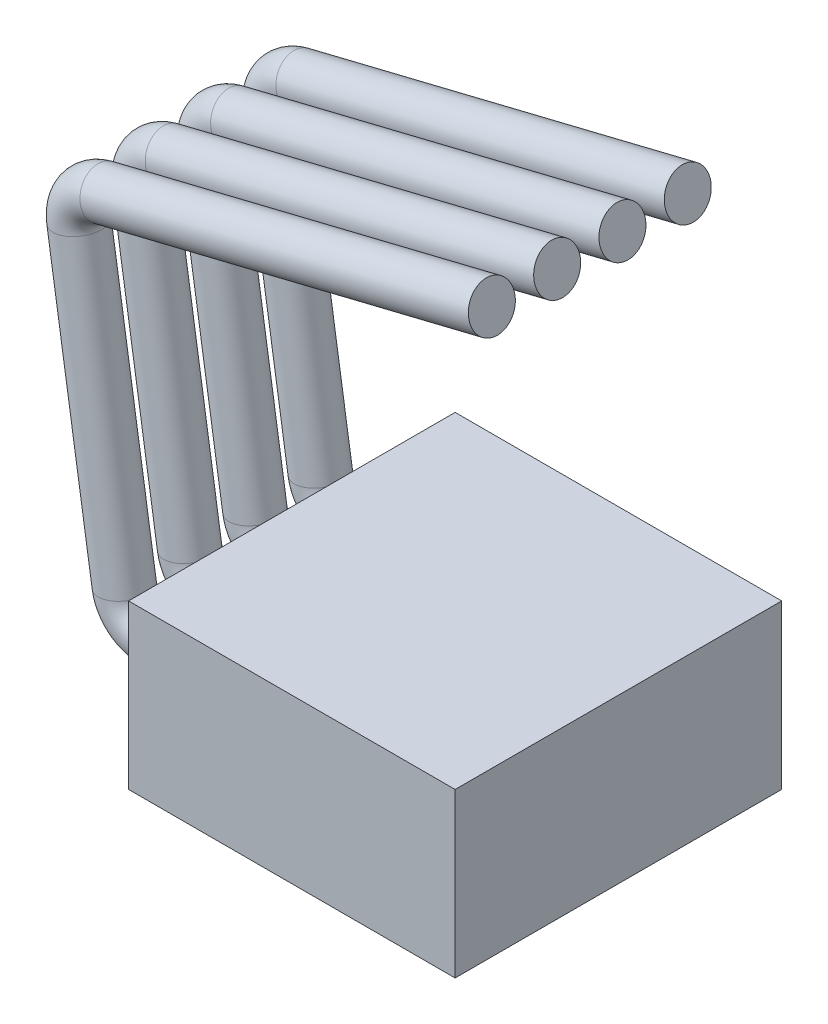
ISO-10303-21;
HEADER;
FILE_DESCRIPTION(('STEP AP214'),'2;1');
FILE_NAME('part.step','',(''),(''),'','','');
FILE_SCHEMA(('AUTOMOTIVE_DESIGN { 1 0 10303 214 1 1 1 1 }'));
ENDSEC;
DATA;
#1=APPLICATION_CONTEXT('core data for automotive mechanical design processes');
#2=APPLICATION_PROTOCOL_DEFINITION('international standard','automotive_design',2000,#1);
#3=PRODUCT_CONTEXT('',#1,'mechanical');
#4=PRODUCT('Part','Part','',(#3));
#5=PRODUCT_RELATED_PRODUCT_CATEGORY('part','',(#4));
#6=PRODUCT_DEFINITION_FORMATION('','',#4);
#7=PRODUCT_DEFINITION_CONTEXT('part definition',#1,'design');
#8=PRODUCT_DEFINITION('design','',#6,#7);
#9=PRODUCT_DEFINITION_SHAPE('','',#8);
#10=(LENGTH_UNIT() NAMED_UNIT(*) SI_UNIT(.MILLI.,.METRE.));
#11=(NAMED_UNIT(*) PLANE_ANGLE_UNIT() SI_UNIT($,.RADIAN.));
#12=(NAMED_UNIT(*) SI_UNIT($,.STERADIAN.) SOLID_ANGLE_UNIT());
#13=UNCERTAINTY_MEASURE_WITH_UNIT(LENGTH_MEASURE(1.E-05),#10,'distance_accuracy_value','');
#14=(GEOMETRIC_REPRESENTATION_CONTEXT(3) GLOBAL_UNCERTAINTY_ASSIGNED_CONTEXT((#13)) GLOBAL_UNIT_ASSIGNED_CONTEXT((#10,
#11,#12)) REPRESENTATION_CONTEXT('',''));
#15=CARTESIAN_POINT('',(0.,0.,0.));
#16=DIRECTION('',(0.,0.,1.));
#17=DIRECTION('',(1.,0.,0.));
#18=AXIS2_PLACEMENT_3D('',#15,#16,#17);
#19=CARTESIAN_POINT('',(-2.73181449711056,2.5,-1.21930927675658));
#20=DIRECTION('',(1.,0.,0.));
#21=DIRECTION('',(0.,0.,-1.));
#22=AXIS2_PLACEMENT_3D('',#19,#20,#21);
#23=PLANE('',#22);
#24=CARTESIAN_POINT('',(-2.73181449711056,1.25,2.78069072324342));
#25=DIRECTION('',(-1.,0.,0.));
#26=DIRECTION('',(0.,0.,1.));
#27=AXIS2_PLACEMENT_3D('',#24,#25,#26);
#28=CIRCLE('',#27,0.35);
#29=CARTESIAN_POINT('',(-2.73181449711056,1.25,3.13069072324342));
#30=VERTEX_POINT('',#29);
#31=EDGE_CURVE('E231',#30,#30,#28,.T.);
#32=ORIENTED_EDGE('',*,*,#31,.F.);
#33=EDGE_LOOP('',(#32));
#34=FACE_BOUND('',#33,.T.);
#35=CARTESIAN_POINT('',(-2.73181449711056,1.25,1.78069072324342));
#36=DIRECTION('',(-1.,0.,0.));
#37=DIRECTION('',(0.,0.,1.));
#38=AXIS2_PLACEMENT_3D('',#35,#36,#37);
#39=CIRCLE('',#38,0.35);
#40=CARTESIAN_POINT('',(-2.73181449711056,1.25,2.13069072324342));
#41=VERTEX_POINT('',#40);
#42=EDGE_CURVE('E207',#41,#41,#39,.T.);
#43=ORIENTED_EDGE('',*,*,#42,.F.);
#44=EDGE_LOOP('',(#43));
#45=FACE_BOUND('',#44,.T.);
#46=CARTESIAN_POINT('',(-2.73181449711056,1.25,0.780690723243416));
#47=DIRECTION('',(-1.,0.,0.));
#48=DIRECTION('',(0.,0.,1.));
#49=AXIS2_PLACEMENT_3D('',#46,#47,#48);
#50=CIRCLE('',#49,0.35);
#51=CARTESIAN_POINT('',(-2.73181449711056,1.25,1.13069072324342));
#52=VERTEX_POINT('',#51);
#53=EDGE_CURVE('E183',#52,#52,#50,.T.);
#54=ORIENTED_EDGE('',*,*,#53,.F.);
#55=EDGE_LOOP('',(#54));
#56=FACE_BOUND('',#55,.T.);
#57=CARTESIAN_POINT('',(-2.73181449711056,1.25,-0.219309276756584));
#58=DIRECTION('',(-1.,0.,0.));
#59=DIRECTION('',(0.,0.,1.));
#60=AXIS2_PLACEMENT_3D('',#57,#58,#59);
#61=CIRCLE('',#60,0.35);
#62=CARTESIAN_POINT('',(-2.73181449711056,1.25,0.130690723243416));
#63=VERTEX_POINT('',#62);
#64=EDGE_CURVE('E12',#63,#63,#61,.T.);
#65=ORIENTED_EDGE('',*,*,#64,.F.);
#66=EDGE_LOOP('',(#65));
#67=FACE_BOUND('',#66,.T.);
#68=DIRECTION('',(0.,0.,1.));
#69=VECTOR('',#68,1.);
#70=CARTESIAN_POINT('',(-2.73181449711056,0.,-1.21930927675658));
#71=LINE('',#70,#69);
#72=CARTESIAN_POINT('',(-2.73181449711056,0.,-1.21930927675658));
#73=VERTEX_POINT('',#72);
#74=CARTESIAN_POINT('',(-2.73181449711056,0.,3.78069072324342));
#75=VERTEX_POINT('',#74);
#76=EDGE_CURVE('E123',#73,#75,#71,.T.);
#77=ORIENTED_EDGE('',*,*,#76,.T.);
#78=DIRECTION('',(0.,-1.,0.));
#79=VECTOR('',#78,1.);
#80=CARTESIAN_POINT('',(-2.73181449711056,2.5,3.78069072324342));
#81=LINE('',#80,#79);
#82=CARTESIAN_POINT('',(-2.73181449711056,2.5,3.78069072324342));
#83=VERTEX_POINT('',#82);
#84=EDGE_CURVE('E55',#83,#75,#81,.T.);
#85=ORIENTED_EDGE('',*,*,#84,.F.);
#86=DIRECTION('',(0.,0.,1.));
#87=VECTOR('',#86,1.);
#88=CARTESIAN_POINT('',(-2.73181449711056,2.5,-1.21930927675658));
#89=LINE('',#88,#87);
#90=CARTESIAN_POINT('',(-2.73181449711056,2.5,-1.21930927675658));
#91=VERTEX_POINT('',#90);
#92=EDGE_CURVE('E106',#91,#83,#89,.T.);
#93=ORIENTED_EDGE('',*,*,#92,.F.);
#94=DIRECTION('',(0.,-1.,0.));
#95=VECTOR('',#94,1.);
#96=CARTESIAN_POINT('',(-2.73181449711056,2.5,-1.21930927675658));
#97=LINE('',#96,#95);
#98=EDGE_CURVE('E119',#91,#73,#97,.T.);
#99=ORIENTED_EDGE('',*,*,#98,.T.);
#100=EDGE_LOOP('',(#77,#85,#93,#99));
#101=FACE_BOUND('',#100,.T.);
#102=ADVANCED_FACE('F52',(#34,#45,#56,#67,#101),#23,.F.);
#103=CARTESIAN_POINT('',(-2.73181449711056,2.5,3.78069072324342));
#104=DIRECTION('',(0.,0.,-1.));
#105=DIRECTION('',(-1.,0.,0.));
#106=AXIS2_PLACEMENT_3D('',#103,#104,#105);
#107=PLANE('',#106);
#108=DIRECTION('',(1.,0.,0.));
#109=VECTOR('',#108,1.);
#110=CARTESIAN_POINT('',(-2.73181449711056,0.,3.78069072324342));
#111=LINE('',#110,#109);
#112=CARTESIAN_POINT('',(2.26818550288944,0.,3.78069072324342));
#113=VERTEX_POINT('',#112);
#114=EDGE_CURVE('E112',#75,#113,#111,.T.);
#115=ORIENTED_EDGE('',*,*,#114,.T.);
#116=DIRECTION('',(0.,-1.,0.));
#117=VECTOR('',#116,1.);
#118=CARTESIAN_POINT('',(2.26818550288944,2.5,3.78069072324342));
#119=LINE('',#118,#117);
#120=CARTESIAN_POINT('',(2.26818550288944,2.5,3.78069072324342));
#121=VERTEX_POINT('',#120);
#122=EDGE_CURVE('E110',#121,#113,#119,.T.);
#123=ORIENTED_EDGE('',*,*,#122,.F.);
#124=DIRECTION('',(1.,0.,0.));
#125=VECTOR('',#124,1.);
#126=CARTESIAN_POINT('',(-2.73181449711056,2.5,3.78069072324342));
#127=LINE('',#126,#125);
#128=EDGE_CURVE('E101',#83,#121,#127,.T.);
#129=ORIENTED_EDGE('',*,*,#128,.F.);
#130=ORIENTED_EDGE('',*,*,#84,.T.);
#131=EDGE_LOOP('',(#115,#123,#129,#130));
#132=FACE_BOUND('',#131,.T.);
#133=ADVANCED_FACE('F111',(#132),#107,.F.);
#134=CARTESIAN_POINT('',(2.26818550288944,2.5,-1.21930927675658));
#135=DIRECTION('',(-1.,0.,0.));
#136=DIRECTION('',(0.,0.,1.));
#137=AXIS2_PLACEMENT_3D('',#134,#135,#136);
#138=PLANE('',#137);
#139=DIRECTION('',(0.,0.,-1.));
#140=VECTOR('',#139,1.);
#141=CARTESIAN_POINT('',(2.26818550288944,0.,-1.21930927675658));
#142=LINE('',#141,#140);
#143=CARTESIAN_POINT('',(2.26818550288944,0.,-1.21930927675658));
#144=VERTEX_POINT('',#143);
#145=EDGE_CURVE('E87',#113,#144,#142,.T.);
#146=ORIENTED_EDGE('',*,*,#145,.T.);
#147=DIRECTION('',(0.,-1.,0.));
#148=VECTOR('',#147,1.);
#149=CARTESIAN_POINT('',(2.26818550288944,2.5,-1.21930927675658));
#150=LINE('',#149,#148);
#151=CARTESIAN_POINT('',(2.26818550288944,2.5,-1.21930927675658));
#152=VERTEX_POINT('',#151);
#153=EDGE_CURVE('E114',#152,#144,#150,.T.);
#154=ORIENTED_EDGE('',*,*,#153,.F.);
#155=DIRECTION('',(0.,0.,-1.));
#156=VECTOR('',#155,1.);
#157=CARTESIAN_POINT('',(2.26818550288944,2.5,-1.21930927675658));
#158=LINE('',#157,#156);
#159=EDGE_CURVE('E104',#121,#152,#158,.T.);
#160=ORIENTED_EDGE('',*,*,#159,.F.);
#161=ORIENTED_EDGE('',*,*,#122,.T.);
#162=EDGE_LOOP('',(#146,#154,#160,#161));
#163=FACE_BOUND('',#162,.T.);
#164=ADVANCED_FACE('F115',(#163),#138,.F.);
#165=CARTESIAN_POINT('',(-2.73181449711056,2.5,-1.21930927675658));
#166=DIRECTION('',(0.,0.,1.));
#167=DIRECTION('',(1.,0.,0.));
#168=AXIS2_PLACEMENT_3D('',#165,#166,#167);
#169=PLANE('',#168);
#170=DIRECTION('',(-1.,0.,0.));
#171=VECTOR('',#170,1.);
#172=CARTESIAN_POINT('',(-2.73181449711056,0.,-1.21930927675658));
#173=LINE('',#172,#171);
#174=EDGE_CURVE('E93',#144,#73,#173,.T.);
#175=ORIENTED_EDGE('',*,*,#174,.T.);
#176=ORIENTED_EDGE('',*,*,#98,.F.);
#177=DIRECTION('',(-1.,0.,0.));
#178=VECTOR('',#177,1.);
#179=CARTESIAN_POINT('',(-2.73181449711056,2.5,-1.21930927675658));
#180=LINE('',#179,#178);
#181=EDGE_CURVE('E70',#152,#91,#180,.T.);
#182=ORIENTED_EDGE('',*,*,#181,.F.);
#183=ORIENTED_EDGE('',*,*,#153,.T.);
#184=EDGE_LOOP('',(#175,#176,#182,#183));
#185=FACE_BOUND('',#184,.T.);
#186=ADVANCED_FACE('F137',(#185),#169,.F.);
#187=CARTESIAN_POINT('',(0.,2.5,0.));
#188=DIRECTION('',(0.,1.,0.));
#189=DIRECTION('',(0.,0.,1.));
#190=AXIS2_PLACEMENT_3D('',#187,#188,#189);
#191=PLANE('',#190);
#192=ORIENTED_EDGE('',*,*,#92,.T.);
#193=ORIENTED_EDGE('',*,*,#128,.T.);
#194=ORIENTED_EDGE('',*,*,#159,.T.);
#195=ORIENTED_EDGE('',*,*,#181,.T.);
#196=EDGE_LOOP('',(#192,#193,#194,#195));
#197=FACE_BOUND('',#196,.T.);
#198=ADVANCED_FACE('F102',(#197),#191,.T.);
#199=CARTESIAN_POINT('',(0.,0.,0.));
#200=DIRECTION('',(0.,1.,0.));
#201=DIRECTION('',(0.,0.,1.));
#202=AXIS2_PLACEMENT_3D('',#199,#200,#201);
#203=PLANE('',#202);
#204=ORIENTED_EDGE('',*,*,#76,.F.);
#205=ORIENTED_EDGE('',*,*,#174,.F.);
#206=ORIENTED_EDGE('',*,*,#145,.F.);
#207=ORIENTED_EDGE('',*,*,#114,.F.);
#208=EDGE_LOOP('',(#204,#205,#206,#207));
#209=FACE_BOUND('',#208,.T.);
#210=ADVANCED_FACE('F140',(#209),#203,.F.);
#211=CARTESIAN_POINT('',(1.83023023670367,8.1836162278972,-0.219309276756584));
#212=DIRECTION('',(0.971175897060315,0.238363959039728,0.));
#213=DIRECTION('',(0.,0.,1.));
#214=AXIS2_PLACEMENT_3D('',#211,#212,#213);
#215=PLANE('',#214);
#216=CARTESIAN_POINT('',(1.83023023670367,8.1836162278972,-0.219309276756584));
#217=DIRECTION('',(0.971175897060315,0.238363959039728,0.));
#218=DIRECTION('',(0.,0.,1.));
#219=AXIS2_PLACEMENT_3D('',#216,#217,#218);
#220=CIRCLE('',#219,0.35);
#221=CARTESIAN_POINT('',(1.83023023670367,8.1836162278972,0.130690723243416));
#222=VERTEX_POINT('',#221);
#223=EDGE_CURVE('E127',#222,#222,#220,.T.);
#224=ORIENTED_EDGE('',*,*,#223,.T.);
#225=EDGE_LOOP('',(#224));
#226=FACE_BOUND('',#225,.T.);
#227=ADVANCED_FACE('F249',(#226),#215,.T.);
#228=CARTESIAN_POINT('',(-2.73181449711056,1.25,-0.219309276756584));
#229=DIRECTION('',(-1.,0.,0.));
#230=DIRECTION('',(0.,-1.,0.));
#231=AXIS2_PLACEMENT_3D('',#228,#229,#230);
#232=CYLINDRICAL_SURFACE('',#231,0.35);
#233=CARTESIAN_POINT('',(-3.30318697354395,1.25,-0.219309276756584));
#234=DIRECTION('',(-1.,0.,0.));
#235=DIRECTION('',(0.,0.,1.));
#236=AXIS2_PLACEMENT_3D('',#233,#234,#235);
#237=CIRCLE('',#236,0.35);
#238=CARTESIAN_POINT('',(-3.30318697354394,0.900000000000017,-0.219309276756584));
#239=VERTEX_POINT('',#238);
#240=EDGE_CURVE('E159',#239,#239,#237,.T.);
#241=ORIENTED_EDGE('',*,*,#240,.F.);
#242=EDGE_LOOP('',(#241));
#243=FACE_BOUND('',#242,.T.);
#244=ORIENTED_EDGE('',*,*,#64,.T.);
#245=EDGE_LOOP('',(#244));
#246=FACE_BOUND('',#245,.T.);
#247=ADVANCED_FACE('F246',(#243,#246),#232,.T.);
#248=CARTESIAN_POINT('',(-3.30318697354395,1.75,-0.219309276756584));
#249=DIRECTION('',(0.,0.,-1.));
#250=DIRECTION('',(-1.,0.,0.));
#251=AXIS2_PLACEMENT_3D('',#248,#249,#250);
#252=TOROIDAL_SURFACE('',#251,0.499999999999983,0.35);
#253=CARTESIAN_POINT('',(-3.79731450727413,1.67359332221769,-0.219309276756584));
#254=DIRECTION('',(-0.152813355564618,0.988255067460361,0.));
#255=DIRECTION('',(0.,0.,1.));
#256=AXIS2_PLACEMENT_3D('',#253,#254,#255);
#257=CIRCLE('',#256,0.35);
#258=CARTESIAN_POINT('',(-4.14320378088524,1.62010864777008,-0.219309276756584));
#259=VERTEX_POINT('',#258);
#260=EDGE_CURVE('E155',#259,#259,#257,.T.);
#261=CARTESIAN_POINT('',(-3.30318697354395,1.75,-0.219309276756584));
#262=DIRECTION('',(0.,0.,-1.));
#263=DIRECTION('',(-1.,0.,0.));
#264=AXIS2_PLACEMENT_3D('',#261,#262,#263);
#265=CIRCLE('',#264,0.849999999999983);
#266=EDGE_CURVE('',#239,#259,#265,.T.);
#267=ORIENTED_EDGE('',*,*,#240,.T.);
#268=ORIENTED_EDGE('',*,*,#260,.F.);
#269=ORIENTED_EDGE('',*,*,#266,.T.);
#270=ORIENTED_EDGE('',*,*,#266,.F.);
#271=EDGE_LOOP('',(#267,#269,#268,#270));
#272=FACE_BOUND('',#271,.T.);
#273=ADVANCED_FACE('F248',(#272),#252,.T.);
#274=CARTESIAN_POINT('',(-3.79731450727413,1.67359332221769,-0.219309276756584));
#275=DIRECTION('',(-0.152813355564624,0.98825506746036,0.));
#276=DIRECTION('',(-0.98825506746036,-0.152813355564624,0.));
#277=AXIS2_PLACEMENT_3D('',#274,#275,#276);
#278=CYLINDRICAL_SURFACE('',#277,0.35);
#279=CARTESIAN_POINT('',(-4.49136746434222,6.16208419642218,-0.219309276756584));
#280=DIRECTION('',(-0.152813355564624,0.98825506746036,0.));
#281=DIRECTION('',(0.,0.,1.));
#282=AXIS2_PLACEMENT_3D('',#279,#280,#281);
#283=CIRCLE('',#282,0.35);
#284=CARTESIAN_POINT('',(-4.83725673795334,6.10859952197456,-0.219309276756584));
#285=VERTEX_POINT('',#284);
#286=EDGE_CURVE('E151',#285,#285,#283,.T.);
#287=ORIENTED_EDGE('',*,*,#286,.F.);
#288=EDGE_LOOP('',(#287));
#289=FACE_BOUND('',#288,.T.);
#290=ORIENTED_EDGE('',*,*,#260,.T.);
#291=EDGE_LOOP('',(#290));
#292=FACE_BOUND('',#291,.T.);
#293=ADVANCED_FACE('F256',(#289,#292),#278,.T.);
#294=CARTESIAN_POINT('',(-3.99723993061203,6.23849087420449,-0.219309276756584));
#295=DIRECTION('',(0.,0.,-1.));
#296=DIRECTION('',(-1.,0.,0.));
#297=AXIS2_PLACEMENT_3D('',#294,#295,#296);
#298=TOROIDAL_SURFACE('',#297,0.500000000000001,0.35);
#299=CARTESIAN_POINT('',(-4.1164219101319,6.72407882273465,-0.219309276756584));
#300=DIRECTION('',(0.971175897060314,0.238363959039729,0.));
#301=DIRECTION('',(0.,0.,1.));
#302=AXIS2_PLACEMENT_3D('',#299,#300,#301);
#303=CIRCLE('',#302,0.35);
#304=CARTESIAN_POINT('',(-4.1998492957958,7.06399038670576,-0.219309276756584));
#305=VERTEX_POINT('',#304);
#306=EDGE_CURVE('E147',#305,#305,#303,.T.);
#307=CARTESIAN_POINT('',(-3.99723993061203,6.23849087420449,-0.219309276756584));
#308=DIRECTION('',(0.,0.,-1.));
#309=DIRECTION('',(-1.,0.,0.));
#310=AXIS2_PLACEMENT_3D('',#307,#308,#309);
#311=CIRCLE('',#310,0.850000000000001);
#312=EDGE_CURVE('',#285,#305,#311,.T.);
#313=ORIENTED_EDGE('',*,*,#286,.T.);
#314=ORIENTED_EDGE('',*,*,#306,.F.);
#315=ORIENTED_EDGE('',*,*,#312,.T.);
#316=ORIENTED_EDGE('',*,*,#312,.F.);
#317=EDGE_LOOP('',(#313,#315,#314,#316));
#318=FACE_BOUND('',#317,.T.);
#319=ADVANCED_FACE('F269',(#318),#298,.T.);
#320=CARTESIAN_POINT('',(-4.1164219101319,6.72407882273465,-0.219309276756584));
#321=DIRECTION('',(0.971175897060314,0.238363959039729,0.));
#322=DIRECTION('',(-0.238363959039729,0.971175897060314,0.));
#323=AXIS2_PLACEMENT_3D('',#320,#321,#322);
#324=CYLINDRICAL_SURFACE('',#323,0.35);
#325=ORIENTED_EDGE('',*,*,#223,.F.);
#326=EDGE_LOOP('',(#325));
#327=FACE_BOUND('',#326,.T.);
#328=ORIENTED_EDGE('',*,*,#306,.T.);
#329=EDGE_LOOP('',(#328));
#330=FACE_BOUND('',#329,.T.);
#331=ADVANCED_FACE('F273',(#327,#330),#324,.T.);
#332=CARTESIAN_POINT('',(1.83023023670367,8.1836162278972,0.780690723243416));
#333=DIRECTION('',(0.971175897060315,0.238363959039728,0.));
#334=DIRECTION('',(0.,0.,1.));
#335=AXIS2_PLACEMENT_3D('',#332,#333,#334);
#336=PLANE('',#335);
#337=CARTESIAN_POINT('',(1.83023023670367,8.1836162278972,0.780690723243416));
#338=DIRECTION('',(0.971175897060315,0.238363959039728,0.));
#339=DIRECTION('',(0.,0.,1.));
#340=AXIS2_PLACEMENT_3D('',#337,#338,#339);
#341=CIRCLE('',#340,0.35);
#342=CARTESIAN_POINT('',(1.83023023670367,8.1836162278972,1.13069072324342));
#343=VERTEX_POINT('',#342);
#344=EDGE_CURVE('E162',#343,#343,#341,.T.);
#345=ORIENTED_EDGE('',*,*,#344,.T.);
#346=EDGE_LOOP('',(#345));
#347=FACE_BOUND('',#346,.T.);
#348=ADVANCED_FACE('F264',(#347),#336,.T.);
#349=CARTESIAN_POINT('',(-2.73181449711056,1.25,0.780690723243416));
#350=DIRECTION('',(-1.,0.,0.));
#351=DIRECTION('',(0.,-1.,0.));
#352=AXIS2_PLACEMENT_3D('',#349,#350,#351);
#353=CYLINDRICAL_SURFACE('',#352,0.35);
#354=CARTESIAN_POINT('',(-3.30318697354395,1.25,0.780690723243416));
#355=DIRECTION('',(-1.,0.,0.));
#356=DIRECTION('',(0.,0.,1.));
#357=AXIS2_PLACEMENT_3D('',#354,#355,#356);
#358=CIRCLE('',#357,0.35);
#359=CARTESIAN_POINT('',(-3.30318697354394,0.900000000000018,0.780690723243416));
#360=VERTEX_POINT('',#359);
#361=EDGE_CURVE('E179',#360,#360,#358,.T.);
#362=ORIENTED_EDGE('',*,*,#361,.F.);
#363=EDGE_LOOP('',(#362));
#364=FACE_BOUND('',#363,.T.);
#365=ORIENTED_EDGE('',*,*,#53,.T.);
#366=EDGE_LOOP('',(#365));
#367=FACE_BOUND('',#366,.T.);
#368=ADVANCED_FACE('F356',(#364,#367),#353,.T.);
#369=CARTESIAN_POINT('',(-3.30318697354395,1.75,0.780690723243416));
#370=DIRECTION('',(0.,0.,-1.));
#371=DIRECTION('',(-1.,0.,0.));
#372=AXIS2_PLACEMENT_3D('',#369,#370,#371);
#373=TOROIDAL_SURFACE('',#372,0.499999999999983,0.35);
#374=CARTESIAN_POINT('',(-3.79731450727413,1.67359332221769,0.780690723243416));
#375=DIRECTION('',(-0.152813355564618,0.988255067460361,0.));
#376=DIRECTION('',(0.,0.,1.));
#377=AXIS2_PLACEMENT_3D('',#374,#375,#376);
#378=CIRCLE('',#377,0.35);
#379=CARTESIAN_POINT('',(-4.14320378088524,1.62010864777008,0.780690723243416));
#380=VERTEX_POINT('',#379);
#381=EDGE_CURVE('E175',#380,#380,#378,.T.);
#382=CARTESIAN_POINT('',(-3.30318697354395,1.75,0.780690723243416));
#383=DIRECTION('',(0.,0.,-1.));
#384=DIRECTION('',(-1.,0.,0.));
#385=AXIS2_PLACEMENT_3D('',#382,#383,#384);
#386=CIRCLE('',#385,0.849999999999983);
#387=EDGE_CURVE('',#360,#380,#386,.T.);
#388=ORIENTED_EDGE('',*,*,#361,.T.);
#389=ORIENTED_EDGE('',*,*,#381,.F.);
#390=ORIENTED_EDGE('',*,*,#387,.T.);
#391=ORIENTED_EDGE('',*,*,#387,.F.);
#392=EDGE_LOOP('',(#388,#390,#389,#391));
#393=FACE_BOUND('',#392,.T.);
#394=ADVANCED_FACE('F366',(#393),#373,.T.);
#395=CARTESIAN_POINT('',(-3.79731450727413,1.67359332221769,0.780690723243416));
#396=DIRECTION('',(-0.152813355564624,0.98825506746036,0.));
#397=DIRECTION('',(-0.98825506746036,-0.152813355564624,0.));
#398=AXIS2_PLACEMENT_3D('',#395,#396,#397);
#399=CYLINDRICAL_SURFACE('',#398,0.35);
#400=CARTESIAN_POINT('',(-4.49136746434222,6.16208419642218,0.780690723243416));
#401=DIRECTION('',(-0.152813355564624,0.98825506746036,0.));
#402=DIRECTION('',(0.,0.,1.));
#403=AXIS2_PLACEMENT_3D('',#400,#401,#402);
#404=CIRCLE('',#403,0.35);
#405=CARTESIAN_POINT('',(-4.83725673795334,6.10859952197456,0.780690723243416));
#406=VERTEX_POINT('',#405);
#407=EDGE_CURVE('E171',#406,#406,#404,.T.);
#408=ORIENTED_EDGE('',*,*,#407,.F.);
#409=EDGE_LOOP('',(#408));
#410=FACE_BOUND('',#409,.T.);
#411=ORIENTED_EDGE('',*,*,#381,.T.);
#412=EDGE_LOOP('',(#411));
#413=FACE_BOUND('',#412,.T.);
#414=ADVANCED_FACE('F376',(#410,#413),#399,.T.);
#415=CARTESIAN_POINT('',(-3.99723993061203,6.23849087420449,0.780690723243416));
#416=DIRECTION('',(0.,0.,-1.));
#417=DIRECTION('',(-1.,0.,0.));
#418=AXIS2_PLACEMENT_3D('',#415,#416,#417);
#419=TOROIDAL_SURFACE('',#418,0.500000000000001,0.35);
#420=CARTESIAN_POINT('',(-4.1164219101319,6.72407882273465,0.780690723243416));
#421=DIRECTION('',(0.971175897060314,0.238363959039729,0.));
#422=DIRECTION('',(0.,0.,1.));
#423=AXIS2_PLACEMENT_3D('',#420,#421,#422);
#424=CIRCLE('',#423,0.35);
#425=CARTESIAN_POINT('',(-4.1998492957958,7.06399038670576,0.780690723243416));
#426=VERTEX_POINT('',#425);
#427=EDGE_CURVE('E167',#426,#426,#424,.T.);
#428=CARTESIAN_POINT('',(-3.99723993061203,6.23849087420449,0.780690723243416));
#429=DIRECTION('',(0.,0.,-1.));
#430=DIRECTION('',(-1.,0.,0.));
#431=AXIS2_PLACEMENT_3D('',#428,#429,#430);
#432=CIRCLE('',#431,0.850000000000001);
#433=EDGE_CURVE('',#406,#426,#432,.T.);
#434=ORIENTED_EDGE('',*,*,#407,.T.);
#435=ORIENTED_EDGE('',*,*,#427,.F.);
#436=ORIENTED_EDGE('',*,*,#433,.T.);
#437=ORIENTED_EDGE('',*,*,#433,.F.);
#438=EDGE_LOOP('',(#434,#436,#435,#437));
#439=FACE_BOUND('',#438,.T.);
#440=ADVANCED_FACE('F386',(#439),#419,.T.);
#441=CARTESIAN_POINT('',(-4.1164219101319,6.72407882273465,0.780690723243416));
#442=DIRECTION('',(0.971175897060314,0.238363959039729,0.));
#443=DIRECTION('',(-0.238363959039729,0.971175897060314,0.));
#444=AXIS2_PLACEMENT_3D('',#441,#442,#443);
#445=CYLINDRICAL_SURFACE('',#444,0.35);
#446=ORIENTED_EDGE('',*,*,#344,.F.);
#447=EDGE_LOOP('',(#446));
#448=FACE_BOUND('',#447,.T.);
#449=ORIENTED_EDGE('',*,*,#427,.T.);
#450=EDGE_LOOP('',(#449));
#451=FACE_BOUND('',#450,.T.);
#452=ADVANCED_FACE('F261',(#448,#451),#445,.T.);
#453=CARTESIAN_POINT('',(1.83023023670367,8.1836162278972,1.78069072324342));
#454=DIRECTION('',(0.971175897060315,0.238363959039728,0.));
#455=DIRECTION('',(0.,0.,1.));
#456=AXIS2_PLACEMENT_3D('',#453,#454,#455);
#457=PLANE('',#456);
#458=CARTESIAN_POINT('',(1.83023023670367,8.1836162278972,1.78069072324342));
#459=DIRECTION('',(0.971175897060315,0.238363959039728,0.));
#460=DIRECTION('',(0.,0.,1.));
#461=AXIS2_PLACEMENT_3D('',#458,#459,#460);
#462=CIRCLE('',#461,0.35);
#463=CARTESIAN_POINT('',(1.83023023670367,8.1836162278972,2.13069072324342));
#464=VERTEX_POINT('',#463);
#465=EDGE_CURVE('E187',#464,#464,#462,.T.);
#466=ORIENTED_EDGE('',*,*,#465,.T.);
#467=EDGE_LOOP('',(#466));
#468=FACE_BOUND('',#467,.T.);
#469=ADVANCED_FACE('F405',(#468),#457,.T.);
#470=CARTESIAN_POINT('',(-2.73181449711056,1.25,1.78069072324342));
#471=DIRECTION('',(-1.,0.,0.));
#472=DIRECTION('',(0.,-1.,0.));
#473=AXIS2_PLACEMENT_3D('',#470,#471,#472);
#474=CYLINDRICAL_SURFACE('',#473,0.35);
#475=CARTESIAN_POINT('',(-3.30318697354395,1.25,1.78069072324342));
#476=DIRECTION('',(-1.,0.,0.));
#477=DIRECTION('',(0.,0.,1.));
#478=AXIS2_PLACEMENT_3D('',#475,#476,#477);
#479=CIRCLE('',#478,0.35);
#480=CARTESIAN_POINT('',(-3.30318697354394,0.900000000000018,1.78069072324342));
#481=VERTEX_POINT('',#480);
#482=EDGE_CURVE('E203',#481,#481,#479,.T.);
#483=ORIENTED_EDGE('',*,*,#482,.F.);
#484=EDGE_LOOP('',(#483));
#485=FACE_BOUND('',#484,.T.);
#486=ORIENTED_EDGE('',*,*,#42,.T.);
#487=EDGE_LOOP('',(#486));
#488=FACE_BOUND('',#487,.T.);
#489=ADVANCED_FACE('F414',(#485,#488),#474,.T.);
#490=CARTESIAN_POINT('',(-3.30318697354395,1.75,1.78069072324342));
#491=DIRECTION('',(0.,0.,-1.));
#492=DIRECTION('',(-1.,0.,0.));
#493=AXIS2_PLACEMENT_3D('',#490,#491,#492);
#494=TOROIDAL_SURFACE('',#493,0.499999999999983,0.35);
#495=CARTESIAN_POINT('',(-3.79731450727413,1.67359332221769,1.78069072324342));
#496=DIRECTION('',(-0.152813355564618,0.988255067460361,0.));
#497=DIRECTION('',(0.,0.,1.));
#498=AXIS2_PLACEMENT_3D('',#495,#496,#497);
#499=CIRCLE('',#498,0.35);
#500=CARTESIAN_POINT('',(-4.14320378088524,1.62010864777008,1.78069072324342));
#501=VERTEX_POINT('',#500);
#502=EDGE_CURVE('E199',#501,#501,#499,.T.);
#503=CARTESIAN_POINT('',(-3.30318697354395,1.75,1.78069072324342));
#504=DIRECTION('',(0.,0.,-1.));
#505=DIRECTION('',(-1.,0.,0.));
#506=AXIS2_PLACEMENT_3D('',#503,#504,#505);
#507=CIRCLE('',#506,0.849999999999983);
#508=EDGE_CURVE('',#481,#501,#507,.T.);
#509=ORIENTED_EDGE('',*,*,#482,.T.);
#510=ORIENTED_EDGE('',*,*,#502,.F.);
#511=ORIENTED_EDGE('',*,*,#508,.T.);
#512=ORIENTED_EDGE('',*,*,#508,.F.);
#513=EDGE_LOOP('',(#509,#511,#510,#512));
#514=FACE_BOUND('',#513,.T.);
#515=ADVANCED_FACE('F425',(#514),#494,.T.);
#516=CARTESIAN_POINT('',(-3.79731450727413,1.67359332221769,1.78069072324342));
#517=DIRECTION('',(-0.152813355564624,0.98825506746036,0.));
#518=DIRECTION('',(-0.98825506746036,-0.152813355564624,0.));
#519=AXIS2_PLACEMENT_3D('',#516,#517,#518);
#520=CYLINDRICAL_SURFACE('',#519,0.35);
#521=CARTESIAN_POINT('',(-4.49136746434222,6.16208419642218,1.78069072324342));
#522=DIRECTION('',(-0.152813355564624,0.98825506746036,0.));
#523=DIRECTION('',(0.,0.,1.));
#524=AXIS2_PLACEMENT_3D('',#521,#522,#523);
#525=CIRCLE('',#524,0.35);
#526=CARTESIAN_POINT('',(-4.83725673795334,6.10859952197456,1.78069072324342));
#527=VERTEX_POINT('',#526);
#528=EDGE_CURVE('E195',#527,#527,#525,.T.);
#529=ORIENTED_EDGE('',*,*,#528,.F.);
#530=EDGE_LOOP('',(#529));
#531=FACE_BOUND('',#530,.T.);
#532=ORIENTED_EDGE('',*,*,#502,.T.);
#533=EDGE_LOOP('',(#532));
#534=FACE_BOUND('',#533,.T.);
#535=ADVANCED_FACE('F435',(#531,#534),#520,.T.);
#536=CARTESIAN_POINT('',(-3.99723993061203,6.23849087420449,1.78069072324342));
#537=DIRECTION('',(0.,0.,-1.));
#538=DIRECTION('',(-1.,0.,0.));
#539=AXIS2_PLACEMENT_3D('',#536,#537,#538);
#540=TOROIDAL_SURFACE('',#539,0.500000000000001,0.35);
#541=CARTESIAN_POINT('',(-4.1164219101319,6.72407882273465,1.78069072324342));
#542=DIRECTION('',(0.971175897060314,0.238363959039729,0.));
#543=DIRECTION('',(0.,0.,1.));
#544=AXIS2_PLACEMENT_3D('',#541,#542,#543);
#545=CIRCLE('',#544,0.35);
#546=CARTESIAN_POINT('',(-4.1998492957958,7.06399038670576,1.78069072324342));
#547=VERTEX_POINT('',#546);
#548=EDGE_CURVE('E191',#547,#547,#545,.T.);
#549=CARTESIAN_POINT('',(-3.99723993061203,6.23849087420449,1.78069072324342));
#550=DIRECTION('',(0.,0.,-1.));
#551=DIRECTION('',(-1.,0.,0.));
#552=AXIS2_PLACEMENT_3D('',#549,#550,#551);
#553=CIRCLE('',#552,0.850000000000001);
#554=EDGE_CURVE('',#527,#547,#553,.T.);
#555=ORIENTED_EDGE('',*,*,#528,.T.);
#556=ORIENTED_EDGE('',*,*,#548,.F.);
#557=ORIENTED_EDGE('',*,*,#554,.T.);
#558=ORIENTED_EDGE('',*,*,#554,.F.);
#559=EDGE_LOOP('',(#555,#557,#556,#558));
#560=FACE_BOUND('',#559,.T.);
#561=ADVANCED_FACE('F445',(#560),#540,.T.);
#562=CARTESIAN_POINT('',(-4.1164219101319,6.72407882273465,1.78069072324342));
#563=DIRECTION('',(0.971175897060314,0.238363959039729,0.));
#564=DIRECTION('',(-0.238363959039729,0.971175897060314,0.));
#565=AXIS2_PLACEMENT_3D('',#562,#563,#564);
#566=CYLINDRICAL_SURFACE('',#565,0.35);
#567=ORIENTED_EDGE('',*,*,#465,.F.);
#568=EDGE_LOOP('',(#567));
#569=FACE_BOUND('',#568,.T.);
#570=ORIENTED_EDGE('',*,*,#548,.T.);
#571=EDGE_LOOP('',(#570));
#572=FACE_BOUND('',#571,.T.);
#573=ADVANCED_FACE('F358',(#569,#572),#566,.T.);
#574=CARTESIAN_POINT('',(1.83023023670367,8.1836162278972,2.78069072324342));
#575=DIRECTION('',(0.971175897060315,0.238363959039728,0.));
#576=DIRECTION('',(0.,0.,1.));
#577=AXIS2_PLACEMENT_3D('',#574,#575,#576);
#578=PLANE('',#577);
#579=CARTESIAN_POINT('',(1.83023023670367,8.1836162278972,2.78069072324342));
#580=DIRECTION('',(0.971175897060315,0.238363959039728,0.));
#581=DIRECTION('',(0.,0.,1.));
#582=AXIS2_PLACEMENT_3D('',#579,#580,#581);
#583=CIRCLE('',#582,0.35);
#584=CARTESIAN_POINT('',(1.83023023670367,8.1836162278972,3.13069072324342));
#585=VERTEX_POINT('',#584);
#586=EDGE_CURVE('E211',#585,#585,#583,.T.);
#587=ORIENTED_EDGE('',*,*,#586,.T.);
#588=EDGE_LOOP('',(#587));
#589=FACE_BOUND('',#588,.T.);
#590=ADVANCED_FACE('F464',(#589),#578,.T.);
#591=CARTESIAN_POINT('',(-2.73181449711056,1.25,2.78069072324342));
#592=DIRECTION('',(-1.,0.,0.));
#593=DIRECTION('',(0.,-1.,0.));
#594=AXIS2_PLACEMENT_3D('',#591,#592,#593);
#595=CYLINDRICAL_SURFACE('',#594,0.35);
#596=CARTESIAN_POINT('',(-3.30318697354395,1.25,2.78069072324342));
#597=DIRECTION('',(-1.,0.,0.));
#598=DIRECTION('',(0.,0.,1.));
#599=AXIS2_PLACEMENT_3D('',#596,#597,#598);
#600=CIRCLE('',#599,0.35);
#601=CARTESIAN_POINT('',(-3.30318697354394,0.900000000000019,2.78069072324342));
#602=VERTEX_POINT('',#601);
#603=EDGE_CURVE('E227',#602,#602,#600,.T.);
#604=ORIENTED_EDGE('',*,*,#603,.F.);
#605=EDGE_LOOP('',(#604));
#606=FACE_BOUND('',#605,.T.);
#607=ORIENTED_EDGE('',*,*,#31,.T.);
#608=EDGE_LOOP('',(#607));
#609=FACE_BOUND('',#608,.T.);
#610=ADVANCED_FACE('F236',(#606,#609),#595,.T.);
#611=CARTESIAN_POINT('',(-3.30318697354395,1.75,2.78069072324342));
#612=DIRECTION('',(0.,0.,-1.));
#613=DIRECTION('',(-1.,0.,0.));
#614=AXIS2_PLACEMENT_3D('',#611,#612,#613);
#615=TOROIDAL_SURFACE('',#614,0.499999999999982,0.35);
#616=CARTESIAN_POINT('',(-3.79731450727413,1.67359332221769,2.78069072324342));
#617=DIRECTION('',(-0.152813355564618,0.988255067460361,0.));
#618=DIRECTION('',(0.,0.,1.));
#619=AXIS2_PLACEMENT_3D('',#616,#617,#618);
#620=CIRCLE('',#619,0.35);
#621=CARTESIAN_POINT('',(-4.14320378088524,1.62010864777008,2.78069072324342));
#622=VERTEX_POINT('',#621);
#623=EDGE_CURVE('E223',#622,#622,#620,.T.);
#624=CARTESIAN_POINT('',(-3.30318697354395,1.75,2.78069072324342));
#625=DIRECTION('',(0.,0.,-1.));
#626=DIRECTION('',(-1.,0.,0.));
#627=AXIS2_PLACEMENT_3D('',#624,#625,#626);
#628=CIRCLE('',#627,0.849999999999982);
#629=EDGE_CURVE('',#602,#622,#628,.T.);
#630=ORIENTED_EDGE('',*,*,#603,.T.);
#631=ORIENTED_EDGE('',*,*,#623,.F.);
#632=ORIENTED_EDGE('',*,*,#629,.T.);
#633=ORIENTED_EDGE('',*,*,#629,.F.);
#634=EDGE_LOOP('',(#630,#632,#631,#633));
#635=FACE_BOUND('',#634,.T.);
#636=ADVANCED_FACE('F483',(#635),#615,.T.);
#637=CARTESIAN_POINT('',(-3.79731450727413,1.67359332221769,2.78069072324342));
#638=DIRECTION('',(-0.152813355564624,0.98825506746036,0.));
#639=DIRECTION('',(-0.98825506746036,-0.152813355564624,0.));
#640=AXIS2_PLACEMENT_3D('',#637,#638,#639);
#641=CYLINDRICAL_SURFACE('',#640,0.35);
#642=CARTESIAN_POINT('',(-4.49136746434221,6.16208419642218,2.78069072324342));
#643=DIRECTION('',(-0.152813355564624,0.98825506746036,0.));
#644=DIRECTION('',(0.,0.,1.));
#645=AXIS2_PLACEMENT_3D('',#642,#643,#644);
#646=CIRCLE('',#645,0.35);
#647=CARTESIAN_POINT('',(-4.83725673795334,6.10859952197456,2.78069072324342));
#648=VERTEX_POINT('',#647);
#649=EDGE_CURVE('E219',#648,#648,#646,.T.);
#650=ORIENTED_EDGE('',*,*,#649,.F.);
#651=EDGE_LOOP('',(#650));
#652=FACE_BOUND('',#651,.T.);
#653=ORIENTED_EDGE('',*,*,#623,.T.);
#654=EDGE_LOOP('',(#653));
#655=FACE_BOUND('',#654,.T.);
#656=ADVANCED_FACE('F493',(#652,#655),#641,.T.);
#657=CARTESIAN_POINT('',(-3.99723993061203,6.23849087420449,2.78069072324342));
#658=DIRECTION('',(0.,0.,-1.));
#659=DIRECTION('',(-1.,0.,0.));
#660=AXIS2_PLACEMENT_3D('',#657,#658,#659);
#661=TOROIDAL_SURFACE('',#660,0.500000000000001,0.35);
#662=CARTESIAN_POINT('',(-4.1164219101319,6.72407882273464,2.78069072324342));
#663=DIRECTION('',(0.971175897060314,0.238363959039729,0.));
#664=DIRECTION('',(0.,0.,1.));
#665=AXIS2_PLACEMENT_3D('',#662,#663,#664);
#666=CIRCLE('',#665,0.35);
#667=CARTESIAN_POINT('',(-4.19984929579581,7.06399038670575,2.78069072324342));
#668=VERTEX_POINT('',#667);
#669=EDGE_CURVE('E215',#668,#668,#666,.T.);
#670=CARTESIAN_POINT('',(-3.99723993061203,6.23849087420449,2.78069072324342));
#671=DIRECTION('',(0.,0.,-1.));
#672=DIRECTION('',(-1.,0.,0.));
#673=AXIS2_PLACEMENT_3D('',#670,#671,#672);
#674=CIRCLE('',#673,0.85);
#675=EDGE_CURVE('',#648,#668,#674,.T.);
#676=ORIENTED_EDGE('',*,*,#649,.T.);
#677=ORIENTED_EDGE('',*,*,#669,.F.);
#678=ORIENTED_EDGE('',*,*,#675,.T.);
#679=ORIENTED_EDGE('',*,*,#675,.F.);
#680=EDGE_LOOP('',(#676,#678,#677,#679));
#681=FACE_BOUND('',#680,.T.);
#682=ADVANCED_FACE('F503',(#681),#661,.T.);
#683=CARTESIAN_POINT('',(-4.1164219101319,6.72407882273464,2.78069072324342));
#684=DIRECTION('',(0.971175897060314,0.238363959039729,0.));
#685=DIRECTION('',(-0.238363959039729,0.971175897060314,0.));
#686=AXIS2_PLACEMENT_3D('',#683,#684,#685);
#687=CYLINDRICAL_SURFACE('',#686,0.35);
#688=ORIENTED_EDGE('',*,*,#586,.F.);
#689=EDGE_LOOP('',(#688));
#690=FACE_BOUND('',#689,.T.);
#691=ORIENTED_EDGE('',*,*,#669,.T.);
#692=EDGE_LOOP('',(#691));
#693=FACE_BOUND('',#692,.T.);
#694=ADVANCED_FACE('F417',(#690,#693),#687,.T.);
#695=CLOSED_SHELL('',(#102,#133,#164,#186,#198,#210,#227,#247,#273,#293,#319,#331,#348,#368,
#394,#414,#440,#452,#469,#489,#515,#535,#561,#573,#590,#610,#636,#656,#682,#694));
#696=MANIFOLD_SOLID_BREP('B2',#695);
#697=ADVANCED_BREP_SHAPE_REPRESENTATION('',(#18,#696),#14);
#698=SHAPE_DEFINITION_REPRESENTATION(#9,#697);
ENDSEC;
END-ISO-10303-21;
